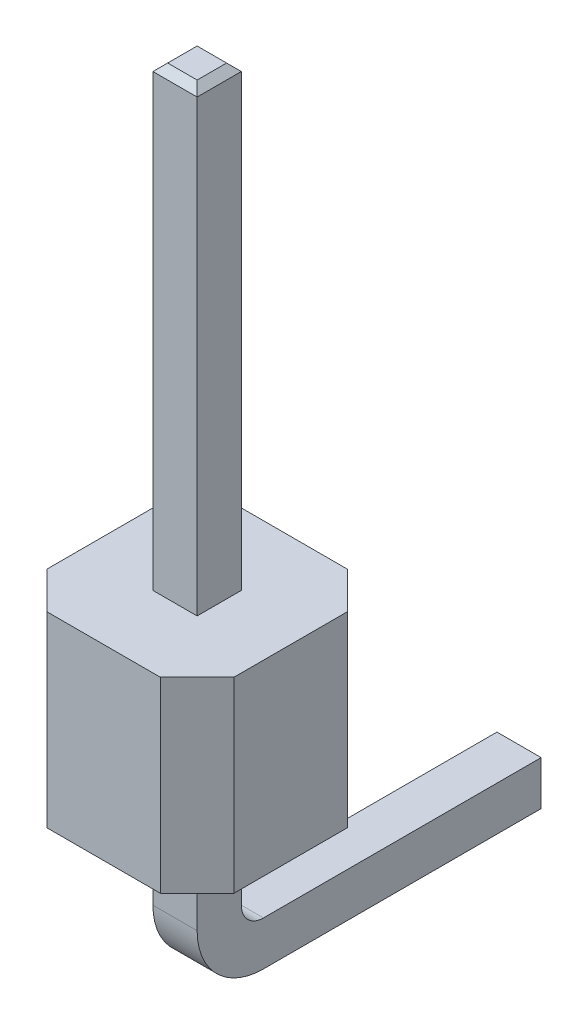
ISO-10303-21;
HEADER;
FILE_DESCRIPTION(('STEP AP214'),'2;1');
FILE_NAME('part.step','',(''),(''),'','','');
FILE_SCHEMA(('AUTOMOTIVE_DESIGN { 1 0 10303 214 1 1 1 1 }'));
ENDSEC;
DATA;
#1=APPLICATION_CONTEXT('core data for automotive mechanical design processes');
#2=APPLICATION_PROTOCOL_DEFINITION('international standard','automotive_design',2000,#1);
#3=PRODUCT_CONTEXT('',#1,'mechanical');
#4=PRODUCT('Part','Part','',(#3));
#5=PRODUCT_RELATED_PRODUCT_CATEGORY('part','',(#4));
#6=PRODUCT_DEFINITION_FORMATION('','',#4);
#7=PRODUCT_DEFINITION_CONTEXT('part definition',#1,'design');
#8=PRODUCT_DEFINITION('design','',#6,#7);
#9=PRODUCT_DEFINITION_SHAPE('','',#8);
#10=(LENGTH_UNIT() NAMED_UNIT(*) SI_UNIT(.MILLI.,.METRE.));
#11=(NAMED_UNIT(*) PLANE_ANGLE_UNIT() SI_UNIT($,.RADIAN.));
#12=(NAMED_UNIT(*) SI_UNIT($,.STERADIAN.) SOLID_ANGLE_UNIT());
#13=UNCERTAINTY_MEASURE_WITH_UNIT(LENGTH_MEASURE(1.E-05),#10,'distance_accuracy_value','');
#14=(GEOMETRIC_REPRESENTATION_CONTEXT(3) GLOBAL_UNCERTAINTY_ASSIGNED_CONTEXT((#13)) GLOBAL_UNIT_ASSIGNED_CONTEXT((#10,
#11,#12)) REPRESENTATION_CONTEXT('',''));
#15=CARTESIAN_POINT('',(0.,0.,0.));
#16=DIRECTION('',(0.,0.,1.));
#17=DIRECTION('',(1.,0.,0.));
#18=AXIS2_PLACEMENT_3D('',#15,#16,#17);
#19=CARTESIAN_POINT('',(0.3,0.599999999999999,0.67));
#20=DIRECTION('',(-1.,0.,0.));
#21=DIRECTION('',(0.,0.,1.));
#22=AXIS2_PLACEMENT_3D('',#19,#20,#21);
#23=CYLINDRICAL_SURFACE('',#22,0.3);
#24=CARTESIAN_POINT('',(-0.3,0.599999999999999,0.67));
#25=DIRECTION('',(-1.,0.,0.));
#26=DIRECTION('',(0.,0.,1.));
#27=AXIS2_PLACEMENT_3D('',#24,#25,#26);
#28=CIRCLE('',#27,0.3);
#29=CARTESIAN_POINT('',(-0.3,0.299999999999999,0.67));
#30=VERTEX_POINT('',#29);
#31=CARTESIAN_POINT('',(-0.3,0.599999999999999,0.97));
#32=VERTEX_POINT('',#31);
#33=EDGE_CURVE('E306',#30,#32,#28,.T.);
#34=ORIENTED_EDGE('',*,*,#33,.T.);
#35=DIRECTION('',(-1.,0.,0.));
#36=VECTOR('',#35,1.);
#37=CARTESIAN_POINT('',(0.3,0.599999999999999,0.97));
#38=LINE('',#37,#36);
#39=CARTESIAN_POINT('',(0.3,0.599999999999999,0.97));
#40=VERTEX_POINT('',#39);
#41=EDGE_CURVE('E331',#40,#32,#38,.T.);
#42=ORIENTED_EDGE('',*,*,#41,.F.);
#43=CARTESIAN_POINT('',(0.3,0.599999999999999,0.67));
#44=DIRECTION('',(-1.,0.,0.));
#45=DIRECTION('',(0.,0.,1.));
#46=AXIS2_PLACEMENT_3D('',#43,#44,#45);
#47=CIRCLE('',#46,0.3);
#48=CARTESIAN_POINT('',(0.3,0.299999999999999,0.67));
#49=VERTEX_POINT('',#48);
#50=EDGE_CURVE('E287',#49,#40,#47,.T.);
#51=ORIENTED_EDGE('',*,*,#50,.F.);
#52=DIRECTION('',(-1.,0.,0.));
#53=VECTOR('',#52,1.);
#54=CARTESIAN_POINT('',(0.3,0.299999999999999,0.67));
#55=LINE('',#54,#53);
#56=EDGE_CURVE('E305',#49,#30,#55,.T.);
#57=ORIENTED_EDGE('',*,*,#56,.T.);
#58=EDGE_LOOP('',(#34,#42,#51,#57));
#59=FACE_BOUND('',#58,.T.);
#60=ADVANCED_FACE('F37',(#59),#23,.F.);
#61=CARTESIAN_POINT('',(0.3,0.599999999999999,0.97));
#62=DIRECTION('',(0.,0.,1.));
#63=DIRECTION('',(0.,-1.,0.));
#64=AXIS2_PLACEMENT_3D('',#61,#62,#63);
#65=PLANE('',#64);
#66=DIRECTION('',(0.,1.,0.));
#67=VECTOR('',#66,1.);
#68=CARTESIAN_POINT('',(-0.3,0.599999999999999,0.97));
#69=LINE('',#68,#67);
#70=CARTESIAN_POINT('',(-0.3,1.76,0.97));
#71=VERTEX_POINT('',#70);
#72=EDGE_CURVE('E311',#32,#71,#69,.T.);
#73=ORIENTED_EDGE('',*,*,#72,.T.);
#74=DIRECTION('',(1.,0.,0.));
#75=VECTOR('',#74,1.);
#76=CARTESIAN_POINT('',(0.3,1.76,0.97));
#77=LINE('',#76,#75);
#78=CARTESIAN_POINT('',(0.3,1.76,0.97));
#79=VERTEX_POINT('',#78);
#80=EDGE_CURVE('E60',#71,#79,#77,.T.);
#81=ORIENTED_EDGE('',*,*,#80,.T.);
#82=DIRECTION('',(0.,1.,0.));
#83=VECTOR('',#82,1.);
#84=CARTESIAN_POINT('',(0.3,0.599999999999999,0.97));
#85=LINE('',#84,#83);
#86=EDGE_CURVE('E292',#40,#79,#85,.T.);
#87=ORIENTED_EDGE('',*,*,#86,.F.);
#88=ORIENTED_EDGE('',*,*,#41,.T.);
#89=EDGE_LOOP('',(#73,#81,#87,#88));
#90=FACE_BOUND('',#89,.T.);
#91=ADVANCED_FACE('F439',(#90),#65,.F.);
#92=CARTESIAN_POINT('',(0.3,0.599999999999999,1.57));
#93=DIRECTION('',(0.,0.,-1.));
#94=DIRECTION('',(0.,1.,0.));
#95=AXIS2_PLACEMENT_3D('',#92,#93,#94);
#96=PLANE('',#95);
#97=DIRECTION('',(0.,-1.,0.));
#98=VECTOR('',#97,1.);
#99=CARTESIAN_POINT('',(0.3,0.599999999999999,1.57));
#100=LINE('',#99,#98);
#101=CARTESIAN_POINT('',(0.3,1.76,1.57));
#102=VERTEX_POINT('',#101);
#103=CARTESIAN_POINT('',(0.3,0.6,1.57));
#104=VERTEX_POINT('',#103);
#105=EDGE_CURVE('E294',#102,#104,#100,.T.);
#106=ORIENTED_EDGE('',*,*,#105,.F.);
#107=DIRECTION('',(-1.,0.,0.));
#108=VECTOR('',#107,1.);
#109=CARTESIAN_POINT('',(0.3,1.76,1.57));
#110=LINE('',#109,#108);
#111=CARTESIAN_POINT('',(-0.3,1.76,1.57));
#112=VERTEX_POINT('',#111);
#113=EDGE_CURVE('E281',#102,#112,#110,.T.);
#114=ORIENTED_EDGE('',*,*,#113,.T.);
#115=DIRECTION('',(0.,-1.,0.));
#116=VECTOR('',#115,1.);
#117=CARTESIAN_POINT('',(-0.3,0.599999999999999,1.57));
#118=LINE('',#117,#116);
#119=CARTESIAN_POINT('',(-0.3,0.6,1.57));
#120=VERTEX_POINT('',#119);
#121=EDGE_CURVE('E313',#112,#120,#118,.T.);
#122=ORIENTED_EDGE('',*,*,#121,.T.);
#123=DIRECTION('',(-1.,0.,0.));
#124=VECTOR('',#123,1.);
#125=CARTESIAN_POINT('',(0.3,0.6,1.57));
#126=LINE('',#125,#124);
#127=EDGE_CURVE('E328',#104,#120,#126,.T.);
#128=ORIENTED_EDGE('',*,*,#127,.F.);
#129=EDGE_LOOP('',(#106,#114,#122,#128));
#130=FACE_BOUND('',#129,.T.);
#131=ADVANCED_FACE('F445',(#130),#96,.F.);
#132=CARTESIAN_POINT('',(0.3,0.6,0.67));
#133=DIRECTION('',(-1.,0.,0.));
#134=DIRECTION('',(0.,0.,1.));
#135=AXIS2_PLACEMENT_3D('',#132,#133,#134);
#136=CYLINDRICAL_SURFACE('',#135,0.9);
#137=CARTESIAN_POINT('',(-0.3,0.6,0.67));
#138=DIRECTION('',(1.,0.,0.));
#139=DIRECTION('',(0.,0.,1.));
#140=AXIS2_PLACEMENT_3D('',#137,#138,#139);
#141=CIRCLE('',#140,0.9);
#142=CARTESIAN_POINT('',(-0.3,-0.3,0.67));
#143=VERTEX_POINT('',#142);
#144=EDGE_CURVE('E317',#120,#143,#141,.T.);
#145=ORIENTED_EDGE('',*,*,#144,.T.);
#146=DIRECTION('',(-1.,0.,0.));
#147=VECTOR('',#146,1.);
#148=CARTESIAN_POINT('',(0.3,-0.3,0.67));
#149=LINE('',#148,#147);
#150=CARTESIAN_POINT('',(0.3,-0.3,0.67));
#151=VERTEX_POINT('',#150);
#152=EDGE_CURVE('E325',#151,#143,#149,.T.);
#153=ORIENTED_EDGE('',*,*,#152,.F.);
#154=CARTESIAN_POINT('',(0.3,0.6,0.67));
#155=DIRECTION('',(1.,0.,0.));
#156=DIRECTION('',(0.,0.,1.));
#157=AXIS2_PLACEMENT_3D('',#154,#155,#156);
#158=CIRCLE('',#157,0.9);
#159=EDGE_CURVE('E298',#104,#151,#158,.T.);
#160=ORIENTED_EDGE('',*,*,#159,.F.);
#161=ORIENTED_EDGE('',*,*,#127,.T.);
#162=EDGE_LOOP('',(#145,#153,#160,#161));
#163=FACE_BOUND('',#162,.T.);
#164=ADVANCED_FACE('F645',(#163),#136,.T.);
#165=CARTESIAN_POINT('',(0.3,-0.3,-3.2));
#166=DIRECTION('',(0.,1.,0.));
#167=DIRECTION('',(0.,0.,1.));
#168=AXIS2_PLACEMENT_3D('',#165,#166,#167);
#169=PLANE('',#168);
#170=DIRECTION('',(0.,0.,-1.));
#171=VECTOR('',#170,1.);
#172=CARTESIAN_POINT('',(-0.3,-0.3,-3.2));
#173=LINE('',#172,#171);
#174=CARTESIAN_POINT('',(-0.3,-0.3,-3.1));
#175=VERTEX_POINT('',#174);
#176=EDGE_CURVE('E319',#143,#175,#173,.T.);
#177=ORIENTED_EDGE('',*,*,#176,.T.);
#178=DIRECTION('',(1.,0.,0.));
#179=VECTOR('',#178,1.);
#180=CARTESIAN_POINT('',(0.3,-0.3,-3.1));
#181=LINE('',#180,#179);
#182=CARTESIAN_POINT('',(0.3,-0.3,-3.1));
#183=VERTEX_POINT('',#182);
#184=EDGE_CURVE('E355',#175,#183,#181,.T.);
#185=ORIENTED_EDGE('',*,*,#184,.T.);
#186=DIRECTION('',(0.,0.,-1.));
#187=VECTOR('',#186,1.);
#188=CARTESIAN_POINT('',(0.3,-0.3,-3.2));
#189=LINE('',#188,#187);
#190=EDGE_CURVE('E300',#151,#183,#189,.T.);
#191=ORIENTED_EDGE('',*,*,#190,.F.);
#192=ORIENTED_EDGE('',*,*,#152,.T.);
#193=EDGE_LOOP('',(#177,#185,#191,#192));
#194=FACE_BOUND('',#193,.T.);
#195=ADVANCED_FACE('F637',(#194),#169,.F.);
#196=CARTESIAN_POINT('',(0.3,-0.3,-3.2));
#197=DIRECTION('',(0.,0.,1.));
#198=DIRECTION('',(1.,0.,0.));
#199=AXIS2_PLACEMENT_3D('',#196,#197,#198);
#200=PLANE('',#199);
#201=DIRECTION('',(-1.,0.,0.));
#202=VECTOR('',#201,1.);
#203=CARTESIAN_POINT('',(0.3,-0.200000000000003,-3.2));
#204=LINE('',#203,#202);
#205=CARTESIAN_POINT('',(0.200000000000002,-0.200000000000003,-3.2));
#206=VERTEX_POINT('',#205);
#207=CARTESIAN_POINT('',(-0.200000000000002,-0.200000000000003,-3.2));
#208=VERTEX_POINT('',#207);
#209=EDGE_CURVE('E334',#206,#208,#204,.T.);
#210=ORIENTED_EDGE('',*,*,#209,.T.);
#211=DIRECTION('',(0.,1.,0.));
#212=VECTOR('',#211,1.);
#213=CARTESIAN_POINT('',(-0.200000000000002,0.299999999999999,-3.2));
#214=LINE('',#213,#212);
#215=CARTESIAN_POINT('',(-0.200000000000002,0.200000000000001,-3.2));
#216=VERTEX_POINT('',#215);
#217=EDGE_CURVE('E340',#208,#216,#214,.T.);
#218=ORIENTED_EDGE('',*,*,#217,.T.);
#219=DIRECTION('',(1.,0.,0.));
#220=VECTOR('',#219,1.);
#221=CARTESIAN_POINT('',(0.3,0.200000000000001,-3.2));
#222=LINE('',#221,#220);
#223=CARTESIAN_POINT('',(0.200000000000002,0.200000000000001,-3.2));
#224=VERTEX_POINT('',#223);
#225=EDGE_CURVE('E338',#216,#224,#222,.T.);
#226=ORIENTED_EDGE('',*,*,#225,.T.);
#227=DIRECTION('',(0.,-1.,0.));
#228=VECTOR('',#227,1.);
#229=CARTESIAN_POINT('',(0.200000000000002,-0.3,-3.2));
#230=LINE('',#229,#228);
#231=EDGE_CURVE('E336',#224,#206,#230,.T.);
#232=ORIENTED_EDGE('',*,*,#231,.T.);
#233=EDGE_LOOP('',(#210,#218,#226,#232));
#234=FACE_BOUND('',#233,.T.);
#235=ADVANCED_FACE('F629',(#234),#200,.F.);
#236=CARTESIAN_POINT('',(0.3,0.299999999999999,-3.2));
#237=DIRECTION('',(0.,-1.,0.));
#238=DIRECTION('',(0.,0.,-1.));
#239=AXIS2_PLACEMENT_3D('',#236,#237,#238);
#240=PLANE('',#239);
#241=DIRECTION('',(0.,0.,1.));
#242=VECTOR('',#241,1.);
#243=CARTESIAN_POINT('',(0.3,0.299999999999999,-3.2));
#244=LINE('',#243,#242);
#245=CARTESIAN_POINT('',(0.3,0.299999999999999,-3.1));
#246=VERTEX_POINT('',#245);
#247=EDGE_CURVE('E303',#246,#49,#244,.T.);
#248=ORIENTED_EDGE('',*,*,#247,.F.);
#249=DIRECTION('',(-1.,0.,0.));
#250=VECTOR('',#249,1.);
#251=CARTESIAN_POINT('',(0.3,0.299999999999999,-3.1));
#252=LINE('',#251,#250);
#253=CARTESIAN_POINT('',(-0.3,0.299999999999999,-3.1));
#254=VERTEX_POINT('',#253);
#255=EDGE_CURVE('E349',#246,#254,#252,.T.);
#256=ORIENTED_EDGE('',*,*,#255,.T.);
#257=DIRECTION('',(0.,0.,1.));
#258=VECTOR('',#257,1.);
#259=CARTESIAN_POINT('',(-0.3,0.299999999999999,-3.2));
#260=LINE('',#259,#258);
#261=EDGE_CURVE('E291',#254,#30,#260,.T.);
#262=ORIENTED_EDGE('',*,*,#261,.T.);
#263=ORIENTED_EDGE('',*,*,#56,.F.);
#264=EDGE_LOOP('',(#248,#256,#262,#263));
#265=FACE_BOUND('',#264,.T.);
#266=ADVANCED_FACE('F623',(#265),#240,.F.);
#267=CARTESIAN_POINT('',(0.3,0.599999999999999,0.67));
#268=DIRECTION('',(-1.,0.,0.));
#269=DIRECTION('',(0.,0.,1.));
#270=AXIS2_PLACEMENT_3D('',#267,#268,#269);
#271=PLANE('',#270);
#272=ORIENTED_EDGE('',*,*,#86,.T.);
#273=DIRECTION('',(0.,0.,1.));
#274=VECTOR('',#273,1.);
#275=CARTESIAN_POINT('',(0.3,1.76,0.67));
#276=LINE('',#275,#274);
#277=EDGE_CURVE('E52',#79,#102,#276,.T.);
#278=ORIENTED_EDGE('',*,*,#277,.T.);
#279=ORIENTED_EDGE('',*,*,#105,.T.);
#280=ORIENTED_EDGE('',*,*,#159,.T.);
#281=ORIENTED_EDGE('',*,*,#190,.T.);
#282=DIRECTION('',(0.,1.,0.));
#283=VECTOR('',#282,1.);
#284=CARTESIAN_POINT('',(0.3,0.599999999999999,-3.1));
#285=LINE('',#284,#283);
#286=EDGE_CURVE('E353',#183,#246,#285,.T.);
#287=ORIENTED_EDGE('',*,*,#286,.T.);
#288=ORIENTED_EDGE('',*,*,#247,.T.);
#289=ORIENTED_EDGE('',*,*,#50,.T.);
#290=EDGE_LOOP('',(#272,#278,#279,#280,#281,#287,#288,#289));
#291=FACE_BOUND('',#290,.T.);
#292=ADVANCED_FACE('F491',(#291),#271,.F.);
#293=CARTESIAN_POINT('',(-0.3,0.599999999999999,0.67));
#294=DIRECTION('',(-1.,0.,0.));
#295=DIRECTION('',(0.,0.,1.));
#296=AXIS2_PLACEMENT_3D('',#293,#294,#295);
#297=PLANE('',#296);
#298=DIRECTION('',(0.,0.,1.));
#299=VECTOR('',#298,1.);
#300=CARTESIAN_POINT('',(-0.3,1.76,0.67));
#301=LINE('',#300,#299);
#302=EDGE_CURVE('E11',#71,#112,#301,.T.);
#303=ORIENTED_EDGE('',*,*,#302,.F.);
#304=ORIENTED_EDGE('',*,*,#72,.F.);
#305=ORIENTED_EDGE('',*,*,#33,.F.);
#306=ORIENTED_EDGE('',*,*,#261,.F.);
#307=DIRECTION('',(0.,-1.,0.));
#308=VECTOR('',#307,1.);
#309=CARTESIAN_POINT('',(-0.3,-0.3,-3.1));
#310=LINE('',#309,#308);
#311=EDGE_CURVE('E346',#254,#175,#310,.T.);
#312=ORIENTED_EDGE('',*,*,#311,.T.);
#313=ORIENTED_EDGE('',*,*,#176,.F.);
#314=ORIENTED_EDGE('',*,*,#144,.F.);
#315=ORIENTED_EDGE('',*,*,#121,.F.);
#316=EDGE_LOOP('',(#303,#304,#305,#306,#312,#313,#314,#315));
#317=FACE_BOUND('',#316,.T.);
#318=ADVANCED_FACE('F462',(#317),#297,.T.);
#319=CARTESIAN_POINT('',(0.3,0.599999999999999,-3.1));
#320=DIRECTION('',(-0.707106781186554,0.,0.707106781186541));
#321=DIRECTION('',(0.,1.,0.));
#322=AXIS2_PLACEMENT_3D('',#319,#320,#321);
#323=PLANE('',#322);
#324=DIRECTION('',(0.577350269189623,0.577350269189622,0.577350269189633));
#325=VECTOR('',#324,1.);
#326=CARTESIAN_POINT('',(0.399999999999999,0.399999999999998,-3.));
#327=LINE('',#326,#325);
#328=EDGE_CURVE('E377',#246,#224,#327,.F.);
#329=ORIENTED_EDGE('',*,*,#328,.F.);
#330=ORIENTED_EDGE('',*,*,#286,.F.);
#331=DIRECTION('',(0.577350269189622,-0.577350269189622,0.577350269189632));
#332=VECTOR('',#331,1.);
#333=CARTESIAN_POINT('',(0.233333333333334,-0.233333333333335,-3.16666666666667));
#334=LINE('',#333,#332);
#335=EDGE_CURVE('E310',#206,#183,#334,.T.);
#336=ORIENTED_EDGE('',*,*,#335,.F.);
#337=ORIENTED_EDGE('',*,*,#231,.F.);
#338=EDGE_LOOP('',(#329,#330,#336,#337));
#339=FACE_BOUND('',#338,.T.);
#340=ADVANCED_FACE('F458',(#339),#323,.F.);
#341=CARTESIAN_POINT('',(0.3,-0.200000000000003,-3.2));
#342=DIRECTION('',(0.,0.707106781186554,0.707106781186541));
#343=DIRECTION('',(-1.,0.,0.));
#344=AXIS2_PLACEMENT_3D('',#341,#342,#343);
#345=PLANE('',#344);
#346=ORIENTED_EDGE('',*,*,#335,.T.);
#347=ORIENTED_EDGE('',*,*,#184,.F.);
#348=DIRECTION('',(-0.577350269189622,-0.577350269189622,0.577350269189632));
#349=VECTOR('',#348,1.);
#350=CARTESIAN_POINT('',(-0.0333333333333368,-0.0333333333333371,-3.36666666666667));
#351=LINE('',#350,#349);
#352=EDGE_CURVE('E374',#208,#175,#351,.T.);
#353=ORIENTED_EDGE('',*,*,#352,.F.);
#354=ORIENTED_EDGE('',*,*,#209,.F.);
#355=EDGE_LOOP('',(#346,#347,#353,#354));
#356=FACE_BOUND('',#355,.T.);
#357=ADVANCED_FACE('F454',(#356),#345,.F.);
#358=CARTESIAN_POINT('',(0.3,0.299999999999999,-3.1));
#359=DIRECTION('',(0.,-0.707106781186554,0.707106781186541));
#360=DIRECTION('',(-1.,0.,0.));
#361=AXIS2_PLACEMENT_3D('',#358,#359,#360);
#362=PLANE('',#361);
#363=ORIENTED_EDGE('',*,*,#328,.T.);
#364=ORIENTED_EDGE('',*,*,#225,.F.);
#365=DIRECTION('',(0.577350269189623,-0.577350269189622,-0.577350269189633));
#366=VECTOR('',#365,1.);
#367=CARTESIAN_POINT('',(-0.100000000000002,0.100000000000001,-3.3));
#368=LINE('',#367,#366);
#369=EDGE_CURVE('E372',#254,#216,#368,.T.);
#370=ORIENTED_EDGE('',*,*,#369,.F.);
#371=ORIENTED_EDGE('',*,*,#255,.F.);
#372=EDGE_LOOP('',(#363,#364,#370,#371));
#373=FACE_BOUND('',#372,.T.);
#374=ADVANCED_FACE('F450',(#373),#362,.F.);
#375=CARTESIAN_POINT('',(-0.200000000000002,-0.3,-3.2));
#376=DIRECTION('',(-0.707106781186554,0.,-0.707106781186541));
#377=DIRECTION('',(0.,-1.,0.));
#378=AXIS2_PLACEMENT_3D('',#375,#376,#377);
#379=PLANE('',#378);
#380=ORIENTED_EDGE('',*,*,#352,.T.);
#381=ORIENTED_EDGE('',*,*,#311,.F.);
#382=ORIENTED_EDGE('',*,*,#369,.T.);
#383=ORIENTED_EDGE('',*,*,#217,.F.);
#384=EDGE_LOOP('',(#380,#381,#382,#383));
#385=FACE_BOUND('',#384,.T.);
#386=ADVANCED_FACE('F447',(#385),#379,.T.);
#387=CARTESIAN_POINT('',(0.,1.76,0.));
#388=DIRECTION('',(0.,-1.,0.));
#389=DIRECTION('',(0.,0.,-1.));
#390=AXIS2_PLACEMENT_3D('',#387,#388,#389);
#391=PLANE('',#390);
#392=DIRECTION('',(0.707106781186546,0.,0.707106781186549));
#393=VECTOR('',#392,1.);
#394=CARTESIAN_POINT('',(-1.27,1.76,2.04));
#395=LINE('',#394,#393);
#396=CARTESIAN_POINT('',(-1.27,1.76,2.04));
#397=VERTEX_POINT('',#396);
#398=CARTESIAN_POINT('',(-0.77,1.76,2.54));
#399=VERTEX_POINT('',#398);
#400=EDGE_CURVE('E218',#397,#399,#395,.T.);
#401=ORIENTED_EDGE('',*,*,#400,.F.);
#402=DIRECTION('',(0.,0.,1.));
#403=VECTOR('',#402,1.);
#404=CARTESIAN_POINT('',(-1.27,1.76,2.04));
#405=LINE('',#404,#403);
#406=CARTESIAN_POINT('',(-1.27,1.76,0.500000000000002));
#407=VERTEX_POINT('',#406);
#408=EDGE_CURVE('E210',#407,#397,#405,.T.);
#409=ORIENTED_EDGE('',*,*,#408,.F.);
#410=DIRECTION('',(-0.707106781186546,0.,0.707106781186549));
#411=VECTOR('',#410,1.);
#412=CARTESIAN_POINT('',(-1.27,1.76,0.500000000000002));
#413=LINE('',#412,#411);
#414=CARTESIAN_POINT('',(-0.77,1.76,0.));
#415=VERTEX_POINT('',#414);
#416=EDGE_CURVE('E242',#415,#407,#413,.T.);
#417=ORIENTED_EDGE('',*,*,#416,.F.);
#418=DIRECTION('',(-1.,0.,0.));
#419=VECTOR('',#418,1.);
#420=CARTESIAN_POINT('',(-0.77,1.76,0.));
#421=LINE('',#420,#419);
#422=CARTESIAN_POINT('',(0.77,1.76,0.));
#423=VERTEX_POINT('',#422);
#424=EDGE_CURVE('E239',#423,#415,#421,.T.);
#425=ORIENTED_EDGE('',*,*,#424,.F.);
#426=DIRECTION('',(-0.707106781186546,0.,-0.707106781186549));
#427=VECTOR('',#426,1.);
#428=CARTESIAN_POINT('',(1.27,1.76,0.500000000000002));
#429=LINE('',#428,#427);
#430=CARTESIAN_POINT('',(1.27,1.76,0.500000000000002));
#431=VERTEX_POINT('',#430);
#432=EDGE_CURVE('E236',#431,#423,#429,.T.);
#433=ORIENTED_EDGE('',*,*,#432,.F.);
#434=DIRECTION('',(0.,0.,-1.));
#435=VECTOR('',#434,1.);
#436=CARTESIAN_POINT('',(1.27,1.76,2.04));
#437=LINE('',#436,#435);
#438=CARTESIAN_POINT('',(1.27,1.76,2.04));
#439=VERTEX_POINT('',#438);
#440=EDGE_CURVE('E233',#439,#431,#437,.T.);
#441=ORIENTED_EDGE('',*,*,#440,.F.);
#442=DIRECTION('',(0.707106781186546,0.,-0.707106781186549));
#443=VECTOR('',#442,1.);
#444=CARTESIAN_POINT('',(1.27,1.76,2.04));
#445=LINE('',#444,#443);
#446=CARTESIAN_POINT('',(0.77,1.76,2.54));
#447=VERTEX_POINT('',#446);
#448=EDGE_CURVE('E222',#447,#439,#445,.T.);
#449=ORIENTED_EDGE('',*,*,#448,.F.);
#450=DIRECTION('',(1.,0.,0.));
#451=VECTOR('',#450,1.);
#452=CARTESIAN_POINT('',(-0.77,1.76,2.54));
#453=LINE('',#452,#451);
#454=EDGE_CURVE('E202',#399,#447,#453,.T.);
#455=ORIENTED_EDGE('',*,*,#454,.F.);
#456=EDGE_LOOP('',(#401,#409,#417,#425,#433,#441,#449,#455));
#457=FACE_BOUND('',#456,.T.);
#458=ORIENTED_EDGE('',*,*,#277,.F.);
#459=ORIENTED_EDGE('',*,*,#80,.F.);
#460=ORIENTED_EDGE('',*,*,#302,.T.);
#461=ORIENTED_EDGE('',*,*,#113,.F.);
#462=EDGE_LOOP('',(#458,#459,#460,#461));
#463=FACE_BOUND('',#462,.T.);
#464=ADVANCED_FACE('F215',(#457,#463),#391,.T.);
#465=CARTESIAN_POINT('',(0.,4.3,0.));
#466=DIRECTION('',(0.,-1.,0.));
#467=DIRECTION('',(0.,0.,-1.));
#468=AXIS2_PLACEMENT_3D('',#465,#466,#467);
#469=PLANE('',#468);
#470=DIRECTION('',(0.707106781186546,0.,0.707106781186549));
#471=VECTOR('',#470,1.);
#472=CARTESIAN_POINT('',(-1.27,4.3,2.04));
#473=LINE('',#472,#471);
#474=CARTESIAN_POINT('',(-1.27,4.3,2.04));
#475=VERTEX_POINT('',#474);
#476=CARTESIAN_POINT('',(-0.77,4.3,2.54));
#477=VERTEX_POINT('',#476);
#478=EDGE_CURVE('E246',#475,#477,#473,.T.);
#479=ORIENTED_EDGE('',*,*,#478,.T.);
#480=DIRECTION('',(1.,0.,0.));
#481=VECTOR('',#480,1.);
#482=CARTESIAN_POINT('',(-0.77,4.3,2.54));
#483=LINE('',#482,#481);
#484=CARTESIAN_POINT('',(0.77,4.3,2.54));
#485=VERTEX_POINT('',#484);
#486=EDGE_CURVE('E204',#477,#485,#483,.T.);
#487=ORIENTED_EDGE('',*,*,#486,.T.);
#488=DIRECTION('',(0.707106781186546,0.,-0.707106781186549));
#489=VECTOR('',#488,1.);
#490=CARTESIAN_POINT('',(1.27,4.3,2.04));
#491=LINE('',#490,#489);
#492=CARTESIAN_POINT('',(1.27,4.3,2.04));
#493=VERTEX_POINT('',#492);
#494=EDGE_CURVE('E249',#485,#493,#491,.T.);
#495=ORIENTED_EDGE('',*,*,#494,.T.);
#496=DIRECTION('',(0.,0.,-1.));
#497=VECTOR('',#496,1.);
#498=CARTESIAN_POINT('',(1.27,4.3,2.04));
#499=LINE('',#498,#497);
#500=CARTESIAN_POINT('',(1.27,4.3,0.500000000000002));
#501=VERTEX_POINT('',#500);
#502=EDGE_CURVE('E252',#493,#501,#499,.T.);
#503=ORIENTED_EDGE('',*,*,#502,.T.);
#504=DIRECTION('',(-0.707106781186546,0.,-0.707106781186549));
#505=VECTOR('',#504,1.);
#506=CARTESIAN_POINT('',(1.27,4.3,0.500000000000002));
#507=LINE('',#506,#505);
#508=CARTESIAN_POINT('',(0.77,4.3,0.));
#509=VERTEX_POINT('',#508);
#510=EDGE_CURVE('E255',#501,#509,#507,.T.);
#511=ORIENTED_EDGE('',*,*,#510,.T.);
#512=DIRECTION('',(-1.,0.,0.));
#513=VECTOR('',#512,1.);
#514=CARTESIAN_POINT('',(-0.77,4.3,0.));
#515=LINE('',#514,#513);
#516=CARTESIAN_POINT('',(-0.77,4.3,0.));
#517=VERTEX_POINT('',#516);
#518=EDGE_CURVE('E258',#509,#517,#515,.T.);
#519=ORIENTED_EDGE('',*,*,#518,.T.);
#520=DIRECTION('',(-0.707106781186546,0.,0.707106781186549));
#521=VECTOR('',#520,1.);
#522=CARTESIAN_POINT('',(-1.27,4.3,0.500000000000002));
#523=LINE('',#522,#521);
#524=CARTESIAN_POINT('',(-1.27,4.3,0.500000000000002));
#525=VERTEX_POINT('',#524);
#526=EDGE_CURVE('E229',#517,#525,#523,.T.);
#527=ORIENTED_EDGE('',*,*,#526,.T.);
#528=DIRECTION('',(0.,0.,1.));
#529=VECTOR('',#528,1.);
#530=CARTESIAN_POINT('',(-1.27,4.3,2.04));
#531=LINE('',#530,#529);
#532=EDGE_CURVE('E226',#525,#475,#531,.T.);
#533=ORIENTED_EDGE('',*,*,#532,.T.);
#534=EDGE_LOOP('',(#479,#487,#495,#503,#511,#519,#527,#533));
#535=FACE_BOUND('',#534,.T.);
#536=DIRECTION('',(1.,0.,0.));
#537=VECTOR('',#536,1.);
#538=CARTESIAN_POINT('',(0.3,4.3,0.97));
#539=LINE('',#538,#537);
#540=CARTESIAN_POINT('',(-0.3,4.3,0.97));
#541=VERTEX_POINT('',#540);
#542=CARTESIAN_POINT('',(0.3,4.3,0.97));
#543=VERTEX_POINT('',#542);
#544=EDGE_CURVE('E277',#541,#543,#539,.T.);
#545=ORIENTED_EDGE('',*,*,#544,.T.);
#546=DIRECTION('',(0.,0.,1.));
#547=VECTOR('',#546,1.);
#548=CARTESIAN_POINT('',(0.3,4.3,0.67));
#549=LINE('',#548,#547);
#550=CARTESIAN_POINT('',(0.3,4.3,1.57));
#551=VERTEX_POINT('',#550);
#552=EDGE_CURVE('E279',#543,#551,#549,.T.);
#553=ORIENTED_EDGE('',*,*,#552,.T.);
#554=DIRECTION('',(-1.,0.,0.));
#555=VECTOR('',#554,1.);
#556=CARTESIAN_POINT('',(0.3,4.3,1.57));
#557=LINE('',#556,#555);
#558=CARTESIAN_POINT('',(-0.3,4.3,1.57));
#559=VERTEX_POINT('',#558);
#560=EDGE_CURVE('E264',#551,#559,#557,.T.);
#561=ORIENTED_EDGE('',*,*,#560,.T.);
#562=DIRECTION('',(0.,0.,1.));
#563=VECTOR('',#562,1.);
#564=CARTESIAN_POINT('',(-0.3,4.3,0.67));
#565=LINE('',#564,#563);
#566=EDGE_CURVE('E45',#541,#559,#565,.T.);
#567=ORIENTED_EDGE('',*,*,#566,.F.);
#568=EDGE_LOOP('',(#545,#553,#561,#567));
#569=FACE_BOUND('',#568,.T.);
#570=ADVANCED_FACE('F421',(#535,#569),#469,.F.);
#571=CARTESIAN_POINT('',(-1.27,1.76,2.04));
#572=DIRECTION('',(-0.707106781186549,0.,0.707106781186546));
#573=DIRECTION('',(0.707106781186546,0.,0.707106781186549));
#574=AXIS2_PLACEMENT_3D('',#571,#572,#573);
#575=PLANE('',#574);
#576=ORIENTED_EDGE('',*,*,#478,.F.);
#577=DIRECTION('',(0.,1.,0.));
#578=VECTOR('',#577,1.);
#579=CARTESIAN_POINT('',(-1.27,1.76,2.04));
#580=LINE('',#579,#578);
#581=EDGE_CURVE('E225',#397,#475,#580,.T.);
#582=ORIENTED_EDGE('',*,*,#581,.F.);
#583=ORIENTED_EDGE('',*,*,#400,.T.);
#584=DIRECTION('',(0.,1.,0.));
#585=VECTOR('',#584,1.);
#586=CARTESIAN_POINT('',(-0.77,1.76,2.54));
#587=LINE('',#586,#585);
#588=EDGE_CURVE('E199',#399,#477,#587,.T.);
#589=ORIENTED_EDGE('',*,*,#588,.T.);
#590=EDGE_LOOP('',(#576,#582,#583,#589));
#591=FACE_BOUND('',#590,.T.);
#592=ADVANCED_FACE('F224',(#591),#575,.T.);
#593=CARTESIAN_POINT('',(-1.27,1.76,2.04));
#594=DIRECTION('',(-1.,0.,0.));
#595=DIRECTION('',(0.,0.,1.));
#596=AXIS2_PLACEMENT_3D('',#593,#594,#595);
#597=PLANE('',#596);
#598=ORIENTED_EDGE('',*,*,#532,.F.);
#599=DIRECTION('',(0.,1.,0.));
#600=VECTOR('',#599,1.);
#601=CARTESIAN_POINT('',(-1.27,1.76,0.500000000000002));
#602=LINE('',#601,#600);
#603=EDGE_CURVE('E265',#407,#525,#602,.T.);
#604=ORIENTED_EDGE('',*,*,#603,.F.);
#605=ORIENTED_EDGE('',*,*,#408,.T.);
#606=ORIENTED_EDGE('',*,*,#581,.T.);
#607=EDGE_LOOP('',(#598,#604,#605,#606));
#608=FACE_BOUND('',#607,.T.);
#609=ADVANCED_FACE('F529',(#608),#597,.T.);
#610=CARTESIAN_POINT('',(-1.27,1.76,0.500000000000002));
#611=DIRECTION('',(-0.707106781186549,0.,-0.707106781186546));
#612=DIRECTION('',(-0.707106781186546,0.,0.707106781186549));
#613=AXIS2_PLACEMENT_3D('',#610,#611,#612);
#614=PLANE('',#613);
#615=ORIENTED_EDGE('',*,*,#526,.F.);
#616=DIRECTION('',(0.,1.,0.));
#617=VECTOR('',#616,1.);
#618=CARTESIAN_POINT('',(-0.77,1.76,0.));
#619=LINE('',#618,#617);
#620=EDGE_CURVE('E267',#415,#517,#619,.T.);
#621=ORIENTED_EDGE('',*,*,#620,.F.);
#622=ORIENTED_EDGE('',*,*,#416,.T.);
#623=ORIENTED_EDGE('',*,*,#603,.T.);
#624=EDGE_LOOP('',(#615,#621,#622,#623));
#625=FACE_BOUND('',#624,.T.);
#626=ADVANCED_FACE('F537',(#625),#614,.T.);
#627=CARTESIAN_POINT('',(-0.77,1.76,0.));
#628=DIRECTION('',(0.,0.,-1.));
#629=DIRECTION('',(-1.,0.,0.));
#630=AXIS2_PLACEMENT_3D('',#627,#628,#629);
#631=PLANE('',#630);
#632=ORIENTED_EDGE('',*,*,#518,.F.);
#633=DIRECTION('',(0.,1.,0.));
#634=VECTOR('',#633,1.);
#635=CARTESIAN_POINT('',(0.77,1.76,0.));
#636=LINE('',#635,#634);
#637=EDGE_CURVE('E269',#423,#509,#636,.T.);
#638=ORIENTED_EDGE('',*,*,#637,.F.);
#639=ORIENTED_EDGE('',*,*,#424,.T.);
#640=ORIENTED_EDGE('',*,*,#620,.T.);
#641=EDGE_LOOP('',(#632,#638,#639,#640));
#642=FACE_BOUND('',#641,.T.);
#643=ADVANCED_FACE('F546',(#642),#631,.T.);
#644=CARTESIAN_POINT('',(1.27,1.76,0.500000000000002));
#645=DIRECTION('',(0.707106781186549,0.,-0.707106781186546));
#646=DIRECTION('',(-0.707106781186546,0.,-0.707106781186549));
#647=AXIS2_PLACEMENT_3D('',#644,#645,#646);
#648=PLANE('',#647);
#649=ORIENTED_EDGE('',*,*,#510,.F.);
#650=DIRECTION('',(0.,1.,0.));
#651=VECTOR('',#650,1.);
#652=CARTESIAN_POINT('',(1.27,1.76,0.500000000000002));
#653=LINE('',#652,#651);
#654=EDGE_CURVE('E271',#431,#501,#653,.T.);
#655=ORIENTED_EDGE('',*,*,#654,.F.);
#656=ORIENTED_EDGE('',*,*,#432,.T.);
#657=ORIENTED_EDGE('',*,*,#637,.T.);
#658=EDGE_LOOP('',(#649,#655,#656,#657));
#659=FACE_BOUND('',#658,.T.);
#660=ADVANCED_FACE('F555',(#659),#648,.T.);
#661=CARTESIAN_POINT('',(1.27,1.76,2.04));
#662=DIRECTION('',(1.,0.,0.));
#663=DIRECTION('',(0.,0.,-1.));
#664=AXIS2_PLACEMENT_3D('',#661,#662,#663);
#665=PLANE('',#664);
#666=ORIENTED_EDGE('',*,*,#502,.F.);
#667=DIRECTION('',(0.,1.,0.));
#668=VECTOR('',#667,1.);
#669=CARTESIAN_POINT('',(1.27,1.76,2.04));
#670=LINE('',#669,#668);
#671=EDGE_CURVE('E273',#439,#493,#670,.T.);
#672=ORIENTED_EDGE('',*,*,#671,.F.);
#673=ORIENTED_EDGE('',*,*,#440,.T.);
#674=ORIENTED_EDGE('',*,*,#654,.T.);
#675=EDGE_LOOP('',(#666,#672,#673,#674));
#676=FACE_BOUND('',#675,.T.);
#677=ADVANCED_FACE('F564',(#676),#665,.T.);
#678=CARTESIAN_POINT('',(1.27,1.76,2.04));
#679=DIRECTION('',(0.707106781186549,0.,0.707106781186546));
#680=DIRECTION('',(0.707106781186546,0.,-0.707106781186549));
#681=AXIS2_PLACEMENT_3D('',#678,#679,#680);
#682=PLANE('',#681);
#683=ORIENTED_EDGE('',*,*,#494,.F.);
#684=DIRECTION('',(0.,1.,0.));
#685=VECTOR('',#684,1.);
#686=CARTESIAN_POINT('',(0.77,1.76,2.54));
#687=LINE('',#686,#685);
#688=EDGE_CURVE('E209',#447,#485,#687,.T.);
#689=ORIENTED_EDGE('',*,*,#688,.F.);
#690=ORIENTED_EDGE('',*,*,#448,.T.);
#691=ORIENTED_EDGE('',*,*,#671,.T.);
#692=EDGE_LOOP('',(#683,#689,#690,#691));
#693=FACE_BOUND('',#692,.T.);
#694=ADVANCED_FACE('F434',(#693),#682,.T.);
#695=CARTESIAN_POINT('',(-0.77,1.76,2.54));
#696=DIRECTION('',(0.,0.,1.));
#697=DIRECTION('',(1.,0.,0.));
#698=AXIS2_PLACEMENT_3D('',#695,#696,#697);
#699=PLANE('',#698);
#700=ORIENTED_EDGE('',*,*,#486,.F.);
#701=ORIENTED_EDGE('',*,*,#588,.F.);
#702=ORIENTED_EDGE('',*,*,#454,.T.);
#703=ORIENTED_EDGE('',*,*,#688,.T.);
#704=EDGE_LOOP('',(#700,#701,#702,#703));
#705=FACE_BOUND('',#704,.T.);
#706=ADVANCED_FACE('F201',(#705),#699,.T.);
#707=CARTESIAN_POINT('',(0.3,10.5,1.57));
#708=DIRECTION('',(0.,-1.,0.));
#709=DIRECTION('',(0.,0.,-1.));
#710=AXIS2_PLACEMENT_3D('',#707,#708,#709);
#711=PLANE('',#710);
#712=DIRECTION('',(0.,0.,1.));
#713=VECTOR('',#712,1.);
#714=CARTESIAN_POINT('',(-0.200000000000002,10.5,1.57));
#715=LINE('',#714,#713);
#716=CARTESIAN_POINT('',(-0.200000000000002,10.5,1.07));
#717=VERTEX_POINT('',#716);
#718=CARTESIAN_POINT('',(-0.200000000000002,10.5,1.47));
#719=VERTEX_POINT('',#718);
#720=EDGE_CURVE('E360',#717,#719,#715,.T.);
#721=ORIENTED_EDGE('',*,*,#720,.T.);
#722=DIRECTION('',(1.,0.,0.));
#723=VECTOR('',#722,1.);
#724=CARTESIAN_POINT('',(0.3,10.5,1.47));
#725=LINE('',#724,#723);
#726=CARTESIAN_POINT('',(0.200000000000002,10.5,1.47));
#727=VERTEX_POINT('',#726);
#728=EDGE_CURVE('E366',#719,#727,#725,.T.);
#729=ORIENTED_EDGE('',*,*,#728,.T.);
#730=DIRECTION('',(0.,0.,-1.));
#731=VECTOR('',#730,1.);
#732=CARTESIAN_POINT('',(0.200000000000002,10.5,1.57));
#733=LINE('',#732,#731);
#734=CARTESIAN_POINT('',(0.200000000000002,10.5,1.07));
#735=VERTEX_POINT('',#734);
#736=EDGE_CURVE('E364',#727,#735,#733,.T.);
#737=ORIENTED_EDGE('',*,*,#736,.T.);
#738=DIRECTION('',(-1.,0.,0.));
#739=VECTOR('',#738,1.);
#740=CARTESIAN_POINT('',(0.3,10.5,1.07));
#741=LINE('',#740,#739);
#742=EDGE_CURVE('E362',#735,#717,#741,.T.);
#743=ORIENTED_EDGE('',*,*,#742,.T.);
#744=EDGE_LOOP('',(#721,#729,#737,#743));
#745=FACE_BOUND('',#744,.T.);
#746=ADVANCED_FACE('F427',(#745),#711,.F.);
#747=CARTESIAN_POINT('',(0.3,10.5,1.07));
#748=DIRECTION('',(0.,-0.707106781186541,0.707106781186554));
#749=DIRECTION('',(-1.,0.,0.));
#750=AXIS2_PLACEMENT_3D('',#747,#748,#749);
#751=PLANE('',#750);
#752=DIRECTION('',(0.577350269189622,0.577350269189632,0.577350269189622));
#753=VECTOR('',#752,1.);
#754=CARTESIAN_POINT('',(-0.0333333333333365,10.6666666666667,1.23666666666666));
#755=LINE('',#754,#753);
#756=CARTESIAN_POINT('',(-0.3,10.4,0.97));
#757=VERTEX_POINT('',#756);
#758=EDGE_CURVE('E385',#717,#757,#755,.F.);
#759=ORIENTED_EDGE('',*,*,#758,.F.);
#760=ORIENTED_EDGE('',*,*,#742,.F.);
#761=DIRECTION('',(0.577350269189622,-0.577350269189632,-0.577350269189622));
#762=VECTOR('',#761,1.);
#763=CARTESIAN_POINT('',(0.233333333333334,10.4666666666667,1.03666666666667));
#764=LINE('',#763,#762);
#765=CARTESIAN_POINT('',(0.3,10.4,0.97));
#766=VERTEX_POINT('',#765);
#767=EDGE_CURVE('E375',#766,#735,#764,.F.);
#768=ORIENTED_EDGE('',*,*,#767,.F.);
#769=DIRECTION('',(1.,0.,0.));
#770=VECTOR('',#769,1.);
#771=CARTESIAN_POINT('',(0.3,10.4,0.97));
#772=LINE('',#771,#770);
#773=EDGE_CURVE('E369',#757,#766,#772,.T.);
#774=ORIENTED_EDGE('',*,*,#773,.F.);
#775=EDGE_LOOP('',(#759,#760,#768,#774));
#776=FACE_BOUND('',#775,.T.);
#777=ADVANCED_FACE('F39',(#776),#751,.F.);
#778=CARTESIAN_POINT('',(0.3,10.4,1.57));
#779=DIRECTION('',(0.,-0.707106781186541,-0.707106781186554));
#780=DIRECTION('',(-1.,0.,0.));
#781=AXIS2_PLACEMENT_3D('',#778,#779,#780);
#782=PLANE('',#781);
#783=DIRECTION('',(0.577350269189622,-0.577350269189632,0.577350269189622));
#784=VECTOR('',#783,1.);
#785=CARTESIAN_POINT('',(0.,10.7,1.27));
#786=LINE('',#785,#784);
#787=CARTESIAN_POINT('',(0.3,10.4,1.57));
#788=VERTEX_POINT('',#787);
#789=EDGE_CURVE('E383',#788,#727,#786,.F.);
#790=ORIENTED_EDGE('',*,*,#789,.T.);
#791=ORIENTED_EDGE('',*,*,#728,.F.);
#792=DIRECTION('',(-0.577350269189622,-0.577350269189632,0.577350269189622));
#793=VECTOR('',#792,1.);
#794=CARTESIAN_POINT('',(-0.233333333333335,10.4666666666667,1.50333333333334));
#795=LINE('',#794,#793);
#796=CARTESIAN_POINT('',(-0.3,10.4,1.57));
#797=VERTEX_POINT('',#796);
#798=EDGE_CURVE('E286',#719,#797,#795,.T.);
#799=ORIENTED_EDGE('',*,*,#798,.T.);
#800=DIRECTION('',(-1.,0.,0.));
#801=VECTOR('',#800,1.);
#802=CARTESIAN_POINT('',(0.3,10.4,1.57));
#803=LINE('',#802,#801);
#804=EDGE_CURVE('E357',#788,#797,#803,.T.);
#805=ORIENTED_EDGE('',*,*,#804,.F.);
#806=EDGE_LOOP('',(#790,#791,#799,#805));
#807=FACE_BOUND('',#806,.T.);
#808=ADVANCED_FACE('F403',(#807),#782,.F.);
#809=CARTESIAN_POINT('',(0.3,10.4,0.67));
#810=DIRECTION('',(-0.707106781186554,-0.707106781186541,0.));
#811=DIRECTION('',(0.,0.,1.));
#812=AXIS2_PLACEMENT_3D('',#809,#810,#811);
#813=PLANE('',#812);
#814=ORIENTED_EDGE('',*,*,#767,.T.);
#815=ORIENTED_EDGE('',*,*,#736,.F.);
#816=ORIENTED_EDGE('',*,*,#789,.F.);
#817=DIRECTION('',(0.,0.,1.));
#818=VECTOR('',#817,1.);
#819=CARTESIAN_POINT('',(0.3,10.4,0.67));
#820=LINE('',#819,#818);
#821=EDGE_CURVE('E351',#766,#788,#820,.T.);
#822=ORIENTED_EDGE('',*,*,#821,.F.);
#823=EDGE_LOOP('',(#814,#815,#816,#822));
#824=FACE_BOUND('',#823,.T.);
#825=ADVANCED_FACE('F425',(#824),#813,.F.);
#826=CARTESIAN_POINT('',(-0.200000000000002,10.5,1.57));
#827=DIRECTION('',(-0.707106781186554,0.707106781186541,0.));
#828=DIRECTION('',(0.,0.,-1.));
#829=AXIS2_PLACEMENT_3D('',#826,#827,#828);
#830=PLANE('',#829);
#831=ORIENTED_EDGE('',*,*,#758,.T.);
#832=DIRECTION('',(0.,0.,-1.));
#833=VECTOR('',#832,1.);
#834=CARTESIAN_POINT('',(-0.3,10.4,0.97));
#835=LINE('',#834,#833);
#836=EDGE_CURVE('E343',#797,#757,#835,.T.);
#837=ORIENTED_EDGE('',*,*,#836,.F.);
#838=ORIENTED_EDGE('',*,*,#798,.F.);
#839=ORIENTED_EDGE('',*,*,#720,.F.);
#840=EDGE_LOOP('',(#831,#837,#838,#839));
#841=FACE_BOUND('',#840,.T.);
#842=ADVANCED_FACE('F410',(#841),#830,.T.);
#843=EDGE_CURVE('E309',#541,#757,#69,.T.);
#844=ORIENTED_EDGE('',*,*,#843,.F.);
#845=ORIENTED_EDGE('',*,*,#566,.T.);
#846=EDGE_CURVE('E314',#797,#559,#118,.T.);
#847=ORIENTED_EDGE('',*,*,#846,.F.);
#848=ORIENTED_EDGE('',*,*,#836,.T.);
#849=EDGE_LOOP('',(#844,#845,#847,#848));
#850=FACE_BOUND('',#849,.T.);
#851=ADVANCED_FACE('F393',(#850),#297,.T.);
#852=ORIENTED_EDGE('',*,*,#552,.F.);
#853=EDGE_CURVE('E290',#543,#766,#85,.T.);
#854=ORIENTED_EDGE('',*,*,#853,.T.);
#855=ORIENTED_EDGE('',*,*,#821,.T.);
#856=EDGE_CURVE('E295',#788,#551,#100,.T.);
#857=ORIENTED_EDGE('',*,*,#856,.T.);
#858=EDGE_LOOP('',(#852,#854,#855,#857));
#859=FACE_BOUND('',#858,.T.);
#860=ADVANCED_FACE('F423',(#859),#271,.F.);
#861=ORIENTED_EDGE('',*,*,#560,.F.);
#862=ORIENTED_EDGE('',*,*,#856,.F.);
#863=ORIENTED_EDGE('',*,*,#804,.T.);
#864=ORIENTED_EDGE('',*,*,#846,.T.);
#865=EDGE_LOOP('',(#861,#862,#863,#864));
#866=FACE_BOUND('',#865,.T.);
#867=ADVANCED_FACE('F398',(#866),#96,.F.);
#868=ORIENTED_EDGE('',*,*,#544,.F.);
#869=ORIENTED_EDGE('',*,*,#843,.T.);
#870=ORIENTED_EDGE('',*,*,#773,.T.);
#871=ORIENTED_EDGE('',*,*,#853,.F.);
#872=EDGE_LOOP('',(#868,#869,#870,#871));
#873=FACE_BOUND('',#872,.T.);
#874=ADVANCED_FACE('F419',(#873),#65,.F.);
#875=CLOSED_SHELL('',(#60,#91,#131,#164,#195,#235,#266,#292,#318,#340,#357,#374,#386,#464,#570,
#592,#609,#626,#643,#660,#677,#694,#706,#746,#777,#808,#825,#842,#851,#860,#867,#874));
#876=MANIFOLD_SOLID_BREP('B2',#875);
#877=ADVANCED_BREP_SHAPE_REPRESENTATION('',(#18,#876),#14);
#878=SHAPE_DEFINITION_REPRESENTATION(#9,#877);
ENDSEC;
END-ISO-10303-21;
